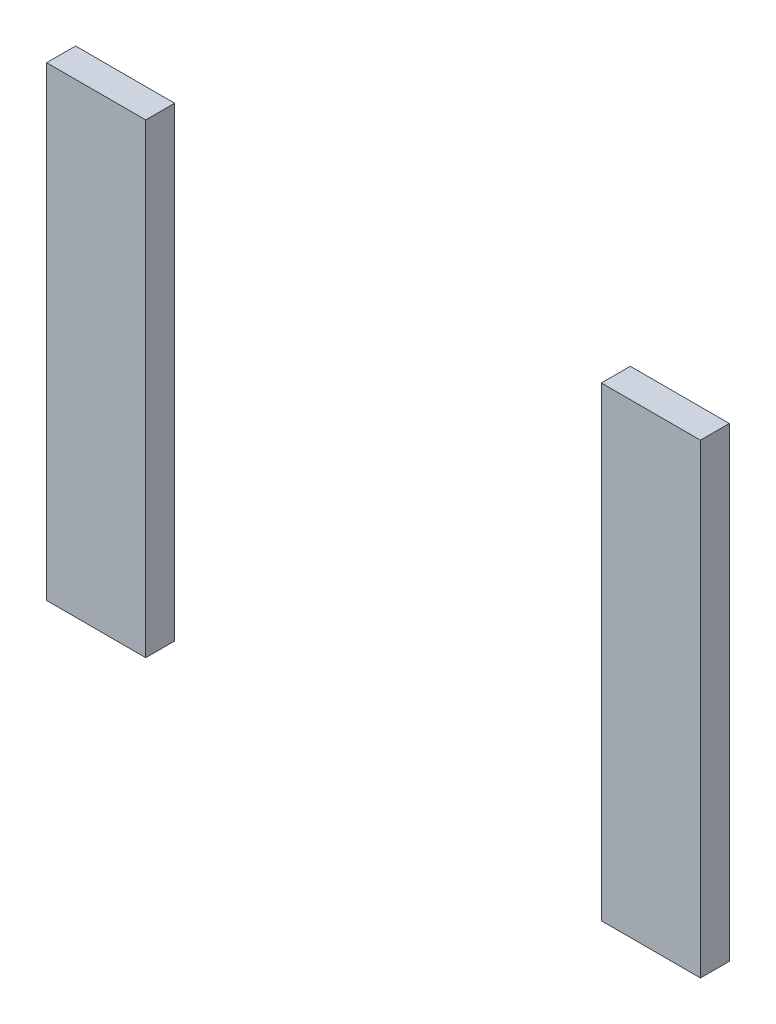
ISO-10303-21;
HEADER;
FILE_DESCRIPTION(('STEP AP214'),'2;1');
FILE_NAME('part.step','',(''),(''),'','','');
FILE_SCHEMA(('AUTOMOTIVE_DESIGN { 1 0 10303 214 1 1 1 1 }'));
ENDSEC;
DATA;
#1=APPLICATION_CONTEXT('core data for automotive mechanical design processes');
#2=APPLICATION_PROTOCOL_DEFINITION('international standard','automotive_design',2000,#1);
#3=PRODUCT_CONTEXT('',#1,'mechanical');
#4=PRODUCT('Part','Part','',(#3));
#5=PRODUCT_RELATED_PRODUCT_CATEGORY('part','',(#4));
#6=PRODUCT_DEFINITION_FORMATION('','',#4);
#7=PRODUCT_DEFINITION_CONTEXT('part definition',#1,'design');
#8=PRODUCT_DEFINITION('design','',#6,#7);
#9=PRODUCT_DEFINITION_SHAPE('','',#8);
#10=(LENGTH_UNIT() NAMED_UNIT(*) SI_UNIT(.MILLI.,.METRE.));
#11=(NAMED_UNIT(*) PLANE_ANGLE_UNIT() SI_UNIT($,.RADIAN.));
#12=(NAMED_UNIT(*) SI_UNIT($,.STERADIAN.) SOLID_ANGLE_UNIT());
#13=UNCERTAINTY_MEASURE_WITH_UNIT(LENGTH_MEASURE(1.E-05),#10,'distance_accuracy_value','');
#14=(GEOMETRIC_REPRESENTATION_CONTEXT(3) GLOBAL_UNCERTAINTY_ASSIGNED_CONTEXT((#13)) GLOBAL_UNIT_ASSIGNED_CONTEXT((#10,
#11,#12)) REPRESENTATION_CONTEXT('',''));
#15=CARTESIAN_POINT('',(0.,0.,0.));
#16=DIRECTION('',(0.,0.,1.));
#17=DIRECTION('',(1.,0.,0.));
#18=AXIS2_PLACEMENT_3D('',#15,#16,#17);
#19=CARTESIAN_POINT('',(-2.26,-1.61,0.2));
#20=DIRECTION('',(0.,0.,1.));
#21=DIRECTION('',(1.,0.,0.));
#22=AXIS2_PLACEMENT_3D('',#19,#20,#21);
#23=PLANE('',#22);
#24=DIRECTION('',(0.,1.,0.));
#25=VECTOR('',#24,1.);
#26=CARTESIAN_POINT('',(-2.26,-1.61,0.2));
#27=LINE('',#26,#25);
#28=CARTESIAN_POINT('',(-2.26,-1.61,0.2));
#29=VERTEX_POINT('',#28);
#30=CARTESIAN_POINT('',(-2.26,1.61,0.2));
#31=VERTEX_POINT('',#30);
#32=EDGE_CURVE('P0_E90',#29,#31,#27,.T.);
#33=ORIENTED_EDGE('',*,*,#32,.F.);
#34=DIRECTION('',(1.,0.,0.));
#35=VECTOR('',#34,1.);
#36=CARTESIAN_POINT('',(-2.26,-1.61,0.2));
#37=LINE('',#36,#35);
#38=CARTESIAN_POINT('',(-1.575,-1.61,0.2));
#39=VERTEX_POINT('',#38);
#40=EDGE_CURVE('P0_E76',#29,#39,#37,.T.);
#41=ORIENTED_EDGE('',*,*,#40,.T.);
#42=DIRECTION('',(0.,1.,0.));
#43=VECTOR('',#42,1.);
#44=CARTESIAN_POINT('',(-1.575,-1.61,0.2));
#45=LINE('',#44,#43);
#46=CARTESIAN_POINT('',(-1.575,1.61,0.2));
#47=VERTEX_POINT('',#46);
#48=EDGE_CURVE('P0_E85',#39,#47,#45,.T.);
#49=ORIENTED_EDGE('',*,*,#48,.T.);
#50=DIRECTION('',(1.,0.,0.));
#51=VECTOR('',#50,1.);
#52=CARTESIAN_POINT('',(-2.26,1.61,0.2));
#53=LINE('',#52,#51);
#54=EDGE_CURVE('P0_E11',#31,#47,#53,.T.);
#55=ORIENTED_EDGE('',*,*,#54,.F.);
#56=EDGE_LOOP('',(#33,#41,#49,#55));
#57=FACE_BOUND('',#56,.T.);
#58=ADVANCED_FACE('P0_F17',(#57),#23,.T.);
#59=CARTESIAN_POINT('',(-2.26,-1.61,0.));
#60=DIRECTION('',(0.,0.,1.));
#61=DIRECTION('',(1.,0.,0.));
#62=AXIS2_PLACEMENT_3D('',#59,#60,#61);
#63=PLANE('',#62);
#64=DIRECTION('',(1.,0.,0.));
#65=VECTOR('',#64,1.);
#66=CARTESIAN_POINT('',(-2.26,1.61,0.));
#67=LINE('',#66,#65);
#68=CARTESIAN_POINT('',(-2.26,1.61,0.));
#69=VERTEX_POINT('',#68);
#70=CARTESIAN_POINT('',(-1.575,1.61,0.));
#71=VERTEX_POINT('',#70);
#72=EDGE_CURVE('P0_E25',#69,#71,#67,.T.);
#73=ORIENTED_EDGE('',*,*,#72,.T.);
#74=DIRECTION('',(0.,1.,0.));
#75=VECTOR('',#74,1.);
#76=CARTESIAN_POINT('',(-1.575,-1.61,0.));
#77=LINE('',#76,#75);
#78=CARTESIAN_POINT('',(-1.575,-1.61,0.));
#79=VERTEX_POINT('',#78);
#80=EDGE_CURVE('P0_E107',#79,#71,#77,.T.);
#81=ORIENTED_EDGE('',*,*,#80,.F.);
#82=DIRECTION('',(1.,0.,0.));
#83=VECTOR('',#82,1.);
#84=CARTESIAN_POINT('',(-2.26,-1.61,0.));
#85=LINE('',#84,#83);
#86=CARTESIAN_POINT('',(-2.26,-1.61,0.));
#87=VERTEX_POINT('',#86);
#88=EDGE_CURVE('P0_E58',#87,#79,#85,.T.);
#89=ORIENTED_EDGE('',*,*,#88,.F.);
#90=DIRECTION('',(0.,1.,0.));
#91=VECTOR('',#90,1.);
#92=CARTESIAN_POINT('',(-2.26,-1.61,0.));
#93=LINE('',#92,#91);
#94=EDGE_CURVE('P0_E91',#87,#69,#93,.T.);
#95=ORIENTED_EDGE('',*,*,#94,.T.);
#96=EDGE_LOOP('',(#73,#81,#89,#95));
#97=FACE_BOUND('',#96,.T.);
#98=ADVANCED_FACE('P0_F123',(#97),#63,.F.);
#99=CARTESIAN_POINT('',(-2.26,1.61,0.));
#100=DIRECTION('',(0.,1.,0.));
#101=DIRECTION('',(1.,0.,0.));
#102=AXIS2_PLACEMENT_3D('',#99,#100,#101);
#103=PLANE('',#102);
#104=ORIENTED_EDGE('',*,*,#72,.F.);
#105=DIRECTION('',(0.,0.,1.));
#106=VECTOR('',#105,1.);
#107=CARTESIAN_POINT('',(-2.26,1.61,0.));
#108=LINE('',#107,#106);
#109=EDGE_CURVE('P0_E95',#69,#31,#108,.T.);
#110=ORIENTED_EDGE('',*,*,#109,.T.);
#111=ORIENTED_EDGE('',*,*,#54,.T.);
#112=DIRECTION('',(0.,0.,1.));
#113=VECTOR('',#112,1.);
#114=CARTESIAN_POINT('',(-1.575,1.61,0.));
#115=LINE('',#114,#113);
#116=EDGE_CURVE('P0_E104',#71,#47,#115,.T.);
#117=ORIENTED_EDGE('',*,*,#116,.F.);
#118=EDGE_LOOP('',(#104,#110,#111,#117));
#119=FACE_BOUND('',#118,.T.);
#120=ADVANCED_FACE('P0_F121',(#119),#103,.T.);
#121=CARTESIAN_POINT('',(-2.26,-1.61,0.));
#122=DIRECTION('',(0.,1.,0.));
#123=DIRECTION('',(1.,0.,0.));
#124=AXIS2_PLACEMENT_3D('',#121,#122,#123);
#125=PLANE('',#124);
#126=DIRECTION('',(0.,0.,1.));
#127=VECTOR('',#126,1.);
#128=CARTESIAN_POINT('',(-1.575,-1.61,0.));
#129=LINE('',#128,#127);
#130=EDGE_CURVE('P0_E82',#79,#39,#129,.T.);
#131=ORIENTED_EDGE('',*,*,#130,.T.);
#132=ORIENTED_EDGE('',*,*,#40,.F.);
#133=DIRECTION('',(0.,0.,1.));
#134=VECTOR('',#133,1.);
#135=CARTESIAN_POINT('',(-2.26,-1.61,0.));
#136=LINE('',#135,#134);
#137=EDGE_CURVE('P0_E79',#87,#29,#136,.T.);
#138=ORIENTED_EDGE('',*,*,#137,.F.);
#139=ORIENTED_EDGE('',*,*,#88,.T.);
#140=EDGE_LOOP('',(#131,#132,#138,#139));
#141=FACE_BOUND('',#140,.T.);
#142=ADVANCED_FACE('P0_F78',(#141),#125,.F.);
#143=CARTESIAN_POINT('',(-1.575,-1.61,0.));
#144=DIRECTION('',(1.,0.,0.));
#145=DIRECTION('',(0.,1.,0.));
#146=AXIS2_PLACEMENT_3D('',#143,#144,#145);
#147=PLANE('',#146);
#148=ORIENTED_EDGE('',*,*,#130,.F.);
#149=ORIENTED_EDGE('',*,*,#80,.T.);
#150=ORIENTED_EDGE('',*,*,#116,.T.);
#151=ORIENTED_EDGE('',*,*,#48,.F.);
#152=EDGE_LOOP('',(#148,#149,#150,#151));
#153=FACE_BOUND('',#152,.T.);
#154=ADVANCED_FACE('P0_F120',(#153),#147,.T.);
#155=CARTESIAN_POINT('',(-2.26,-1.61,0.));
#156=DIRECTION('',(1.,0.,0.));
#157=DIRECTION('',(0.,1.,0.));
#158=AXIS2_PLACEMENT_3D('',#155,#156,#157);
#159=PLANE('',#158);
#160=ORIENTED_EDGE('',*,*,#32,.T.);
#161=ORIENTED_EDGE('',*,*,#109,.F.);
#162=ORIENTED_EDGE('',*,*,#94,.F.);
#163=ORIENTED_EDGE('',*,*,#137,.T.);
#164=EDGE_LOOP('',(#160,#161,#162,#163));
#165=FACE_BOUND('',#164,.T.);
#166=ADVANCED_FACE('P0_F88',(#165),#159,.F.);
#167=CLOSED_SHELL('',(#58,#98,#120,#142,#154,#166));
#168=MANIFOLD_SOLID_BREP('P0_B1',#167);
#169=CARTESIAN_POINT('',(1.575,-1.61,0.2));
#170=DIRECTION('',(0.,0.,1.));
#171=DIRECTION('',(1.,0.,0.));
#172=AXIS2_PLACEMENT_3D('',#169,#170,#171);
#173=PLANE('',#172);
#174=DIRECTION('',(0.,1.,0.));
#175=VECTOR('',#174,1.);
#176=CARTESIAN_POINT('',(1.575,-1.61,0.2));
#177=LINE('',#176,#175);
#178=CARTESIAN_POINT('',(1.575,-1.61,0.2));
#179=VERTEX_POINT('',#178);
#180=CARTESIAN_POINT('',(1.575,1.61,0.2));
#181=VERTEX_POINT('',#180);
#182=EDGE_CURVE('P1_E88',#179,#181,#177,.T.);
#183=ORIENTED_EDGE('',*,*,#182,.F.);
#184=DIRECTION('',(1.,0.,0.));
#185=VECTOR('',#184,1.);
#186=CARTESIAN_POINT('',(1.575,-1.61,0.2));
#187=LINE('',#186,#185);
#188=CARTESIAN_POINT('',(2.26,-1.61,0.2));
#189=VERTEX_POINT('',#188);
#190=EDGE_CURVE('P1_E71',#179,#189,#187,.T.);
#191=ORIENTED_EDGE('',*,*,#190,.T.);
#192=DIRECTION('',(0.,1.,0.));
#193=VECTOR('',#192,1.);
#194=CARTESIAN_POINT('',(2.26,-1.61,0.2));
#195=LINE('',#194,#193);
#196=CARTESIAN_POINT('',(2.26,1.61,0.2));
#197=VERTEX_POINT('',#196);
#198=EDGE_CURVE('P1_E82',#189,#197,#195,.T.);
#199=ORIENTED_EDGE('',*,*,#198,.T.);
#200=DIRECTION('',(1.,0.,0.));
#201=VECTOR('',#200,1.);
#202=CARTESIAN_POINT('',(1.575,1.61,0.2));
#203=LINE('',#202,#201);
#204=EDGE_CURVE('P1_E11',#181,#197,#203,.T.);
#205=ORIENTED_EDGE('',*,*,#204,.F.);
#206=EDGE_LOOP('',(#183,#191,#199,#205));
#207=FACE_BOUND('',#206,.T.);
#208=ADVANCED_FACE('P1_F17',(#207),#173,.T.);
#209=CARTESIAN_POINT('',(1.575,-1.61,0.));
#210=DIRECTION('',(0.,0.,1.));
#211=DIRECTION('',(1.,0.,0.));
#212=AXIS2_PLACEMENT_3D('',#209,#210,#211);
#213=PLANE('',#212);
#214=DIRECTION('',(1.,0.,0.));
#215=VECTOR('',#214,1.);
#216=CARTESIAN_POINT('',(1.575,1.61,0.));
#217=LINE('',#216,#215);
#218=CARTESIAN_POINT('',(1.575,1.61,0.));
#219=VERTEX_POINT('',#218);
#220=CARTESIAN_POINT('',(2.26,1.61,0.));
#221=VERTEX_POINT('',#220);
#222=EDGE_CURVE('P1_E26',#219,#221,#217,.T.);
#223=ORIENTED_EDGE('',*,*,#222,.T.);
#224=DIRECTION('',(0.,1.,0.));
#225=VECTOR('',#224,1.);
#226=CARTESIAN_POINT('',(2.26,-1.61,0.));
#227=LINE('',#226,#225);
#228=CARTESIAN_POINT('',(2.26,-1.61,0.));
#229=VERTEX_POINT('',#228);
#230=EDGE_CURVE('P1_E100',#229,#221,#227,.T.);
#231=ORIENTED_EDGE('',*,*,#230,.F.);
#232=DIRECTION('',(1.,0.,0.));
#233=VECTOR('',#232,1.);
#234=CARTESIAN_POINT('',(1.575,-1.61,0.));
#235=LINE('',#234,#233);
#236=CARTESIAN_POINT('',(1.575,-1.61,0.));
#237=VERTEX_POINT('',#236);
#238=EDGE_CURVE('P1_E81',#237,#229,#235,.T.);
#239=ORIENTED_EDGE('',*,*,#238,.F.);
#240=DIRECTION('',(0.,1.,0.));
#241=VECTOR('',#240,1.);
#242=CARTESIAN_POINT('',(1.575,-1.61,0.));
#243=LINE('',#242,#241);
#244=EDGE_CURVE('P1_E89',#237,#219,#243,.T.);
#245=ORIENTED_EDGE('',*,*,#244,.T.);
#246=EDGE_LOOP('',(#223,#231,#239,#245));
#247=FACE_BOUND('',#246,.T.);
#248=ADVANCED_FACE('P1_F116',(#247),#213,.F.);
#249=CARTESIAN_POINT('',(1.575,1.61,0.));
#250=DIRECTION('',(0.,1.,0.));
#251=DIRECTION('',(1.,0.,0.));
#252=AXIS2_PLACEMENT_3D('',#249,#250,#251);
#253=PLANE('',#252);
#254=ORIENTED_EDGE('',*,*,#222,.F.);
#255=DIRECTION('',(0.,0.,1.));
#256=VECTOR('',#255,1.);
#257=CARTESIAN_POINT('',(1.575,1.61,0.));
#258=LINE('',#257,#256);
#259=EDGE_CURVE('P1_E93',#219,#181,#258,.T.);
#260=ORIENTED_EDGE('',*,*,#259,.T.);
#261=ORIENTED_EDGE('',*,*,#204,.T.);
#262=DIRECTION('',(0.,0.,1.));
#263=VECTOR('',#262,1.);
#264=CARTESIAN_POINT('',(2.26,1.61,0.));
#265=LINE('',#264,#263);
#266=EDGE_CURVE('P1_E106',#221,#197,#265,.T.);
#267=ORIENTED_EDGE('',*,*,#266,.F.);
#268=EDGE_LOOP('',(#254,#260,#261,#267));
#269=FACE_BOUND('',#268,.T.);
#270=ADVANCED_FACE('P1_F119',(#269),#253,.T.);
#271=CARTESIAN_POINT('',(1.575,-1.61,0.));
#272=DIRECTION('',(0.,1.,0.));
#273=DIRECTION('',(1.,0.,0.));
#274=AXIS2_PLACEMENT_3D('',#271,#272,#273);
#275=PLANE('',#274);
#276=DIRECTION('',(0.,0.,1.));
#277=VECTOR('',#276,1.);
#278=CARTESIAN_POINT('',(2.26,-1.61,0.));
#279=LINE('',#278,#277);
#280=EDGE_CURVE('P1_E76',#229,#189,#279,.T.);
#281=ORIENTED_EDGE('',*,*,#280,.T.);
#282=ORIENTED_EDGE('',*,*,#190,.F.);
#283=DIRECTION('',(0.,0.,1.));
#284=VECTOR('',#283,1.);
#285=CARTESIAN_POINT('',(1.575,-1.61,0.));
#286=LINE('',#285,#284);
#287=EDGE_CURVE('P1_E73',#237,#179,#286,.T.);
#288=ORIENTED_EDGE('',*,*,#287,.F.);
#289=ORIENTED_EDGE('',*,*,#238,.T.);
#290=EDGE_LOOP('',(#281,#282,#288,#289));
#291=FACE_BOUND('',#290,.T.);
#292=ADVANCED_FACE('P1_F19',(#291),#275,.F.);
#293=CARTESIAN_POINT('',(2.26,-1.61,0.));
#294=DIRECTION('',(1.,0.,0.));
#295=DIRECTION('',(0.,1.,0.));
#296=AXIS2_PLACEMENT_3D('',#293,#294,#295);
#297=PLANE('',#296);
#298=ORIENTED_EDGE('',*,*,#280,.F.);
#299=ORIENTED_EDGE('',*,*,#230,.T.);
#300=ORIENTED_EDGE('',*,*,#266,.T.);
#301=ORIENTED_EDGE('',*,*,#198,.F.);
#302=EDGE_LOOP('',(#298,#299,#300,#301));
#303=FACE_BOUND('',#302,.T.);
#304=ADVANCED_FACE('P1_F118',(#303),#297,.T.);
#305=CARTESIAN_POINT('',(1.575,-1.61,0.));
#306=DIRECTION('',(1.,0.,0.));
#307=DIRECTION('',(0.,1.,0.));
#308=AXIS2_PLACEMENT_3D('',#305,#306,#307);
#309=PLANE('',#308);
#310=ORIENTED_EDGE('',*,*,#182,.T.);
#311=ORIENTED_EDGE('',*,*,#259,.F.);
#312=ORIENTED_EDGE('',*,*,#244,.F.);
#313=ORIENTED_EDGE('',*,*,#287,.T.);
#314=EDGE_LOOP('',(#310,#311,#312,#313));
#315=FACE_BOUND('',#314,.T.);
#316=ADVANCED_FACE('P1_F86',(#315),#309,.F.);
#317=CLOSED_SHELL('',(#208,#248,#270,#292,#304,#316));
#318=MANIFOLD_SOLID_BREP('P1_B1',#317);
#319=ADVANCED_BREP_SHAPE_REPRESENTATION('',(#18,#168,#318),#14);
#320=SHAPE_DEFINITION_REPRESENTATION(#9,#319);
ENDSEC;
END-ISO-10303-21;
